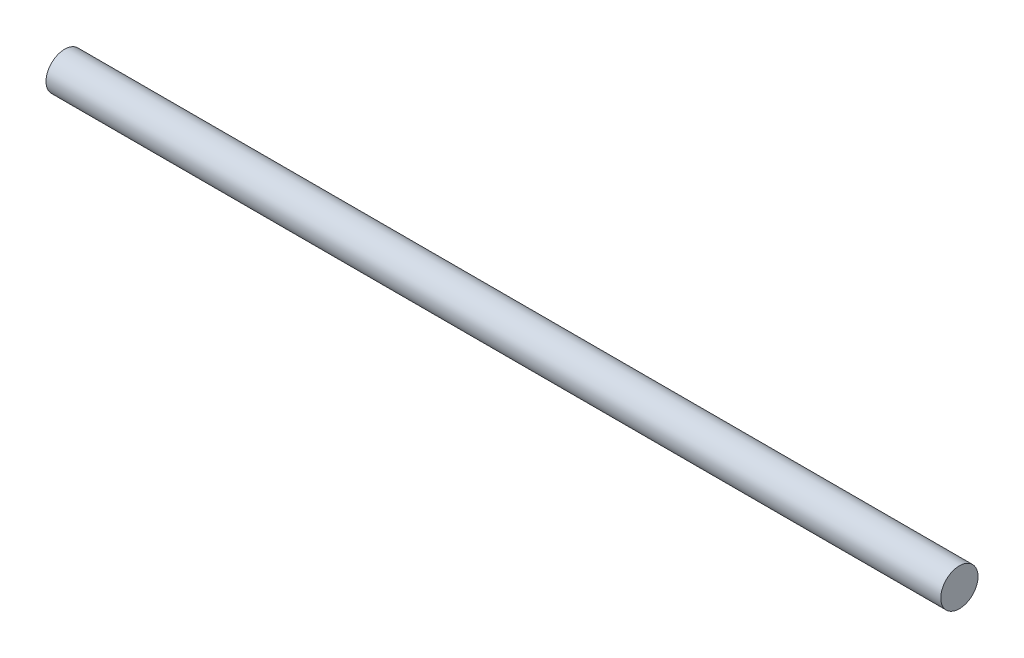
ISO-10303-21;
HEADER;
FILE_DESCRIPTION(('STEP AP214'),'2;1');
FILE_NAME('part.step','',(''),(''),'','','');
FILE_SCHEMA(('AUTOMOTIVE_DESIGN { 1 0 10303 214 1 1 1 1 }'));
ENDSEC;
DATA;
#1=APPLICATION_CONTEXT('core data for automotive mechanical design processes');
#2=APPLICATION_PROTOCOL_DEFINITION('international standard','automotive_design',2000,#1);
#3=PRODUCT_CONTEXT('',#1,'mechanical');
#4=PRODUCT('Part','Part','',(#3));
#5=PRODUCT_RELATED_PRODUCT_CATEGORY('part','',(#4));
#6=PRODUCT_DEFINITION_FORMATION('','',#4);
#7=PRODUCT_DEFINITION_CONTEXT('part definition',#1,'design');
#8=PRODUCT_DEFINITION('design','',#6,#7);
#9=PRODUCT_DEFINITION_SHAPE('','',#8);
#10=(LENGTH_UNIT() NAMED_UNIT(*) SI_UNIT(.MILLI.,.METRE.));
#11=(NAMED_UNIT(*) PLANE_ANGLE_UNIT() SI_UNIT($,.RADIAN.));
#12=(NAMED_UNIT(*) SI_UNIT($,.STERADIAN.) SOLID_ANGLE_UNIT());
#13=UNCERTAINTY_MEASURE_WITH_UNIT(LENGTH_MEASURE(1.E-05),#10,'distance_accuracy_value','');
#14=(GEOMETRIC_REPRESENTATION_CONTEXT(3) GLOBAL_UNCERTAINTY_ASSIGNED_CONTEXT((#13)) GLOBAL_UNIT_ASSIGNED_CONTEXT((#10,
#11,#12)) REPRESENTATION_CONTEXT('',''));
#15=CARTESIAN_POINT('',(0.,0.,0.));
#16=DIRECTION('',(0.,0.,1.));
#17=DIRECTION('',(1.,0.,0.));
#18=AXIS2_PLACEMENT_3D('',#15,#16,#17);
#19=CARTESIAN_POINT('',(152.4,0.,0.));
#20=DIRECTION('',(-1.,0.,0.));
#21=DIRECTION('',(0.,0.,1.));
#22=AXIS2_PLACEMENT_3D('',#19,#20,#21);
#23=CYLINDRICAL_SURFACE('',#22,3.175);
#24=CARTESIAN_POINT('',(152.4,0.,0.));
#25=DIRECTION('',(1.,0.,0.));
#26=DIRECTION('',(0.,0.,-1.));
#27=AXIS2_PLACEMENT_3D('',#24,#25,#26);
#28=CIRCLE('',#27,3.175);
#29=CARTESIAN_POINT('',(152.4,0.,3.175));
#30=VERTEX_POINT('',#29);
#31=EDGE_CURVE('E10',#30,#30,#28,.T.);
#32=CARTESIAN_POINT('',(0.,0.,0.));
#33=DIRECTION('',(1.,0.,0.));
#34=DIRECTION('',(0.,0.,-1.));
#35=AXIS2_PLACEMENT_3D('',#32,#33,#34);
#36=CIRCLE('',#35,3.175);
#37=CARTESIAN_POINT('',(0.,0.,3.175));
#38=VERTEX_POINT('',#37);
#39=EDGE_CURVE('E44',#38,#38,#36,.T.);
#40=CARTESIAN_POINT('',(152.4,0.,3.175));
#41=CARTESIAN_POINT('',(150.8125,0.,3.175));
#42=CARTESIAN_POINT('',(149.225,0.,3.175));
#43=CARTESIAN_POINT('',(146.05,0.,3.175));
#44=CARTESIAN_POINT('',(144.4625,0.,3.175));
#45=CARTESIAN_POINT('',(141.2875,0.,3.175));
#46=CARTESIAN_POINT('',(139.7,0.,3.175));
#47=CARTESIAN_POINT('',(136.525,0.,3.175));
#48=CARTESIAN_POINT('',(134.9375,0.,3.175));
#49=CARTESIAN_POINT('',(131.7625,0.,3.175));
#50=CARTESIAN_POINT('',(130.175,0.,3.175));
#51=CARTESIAN_POINT('',(127.,0.,3.175));
#52=CARTESIAN_POINT('',(125.4125,0.,3.175));
#53=CARTESIAN_POINT('',(122.2375,0.,3.175));
#54=CARTESIAN_POINT('',(120.65,0.,3.175));
#55=CARTESIAN_POINT('',(117.475,0.,3.175));
#56=CARTESIAN_POINT('',(115.8875,0.,3.175));
#57=CARTESIAN_POINT('',(112.7125,0.,3.175));
#58=CARTESIAN_POINT('',(111.125,0.,3.175));
#59=CARTESIAN_POINT('',(107.95,0.,3.175));
#60=CARTESIAN_POINT('',(106.3625,0.,3.175));
#61=CARTESIAN_POINT('',(103.1875,0.,3.175));
#62=CARTESIAN_POINT('',(101.6,0.,3.175));
#63=CARTESIAN_POINT('',(98.425,0.,3.175));
#64=CARTESIAN_POINT('',(96.8375,0.,3.175));
#65=CARTESIAN_POINT('',(93.6625,0.,3.175));
#66=CARTESIAN_POINT('',(92.075,0.,3.175));
#67=CARTESIAN_POINT('',(88.9,0.,3.175));
#68=CARTESIAN_POINT('',(87.3125,0.,3.175));
#69=CARTESIAN_POINT('',(84.1375,0.,3.175));
#70=CARTESIAN_POINT('',(82.55,0.,3.175));
#71=CARTESIAN_POINT('',(79.375,0.,3.175));
#72=CARTESIAN_POINT('',(77.7875,0.,3.175));
#73=CARTESIAN_POINT('',(74.6125,0.,3.175));
#74=CARTESIAN_POINT('',(73.025,0.,3.175));
#75=CARTESIAN_POINT('',(69.85,0.,3.175));
#76=CARTESIAN_POINT('',(68.2625,0.,3.175));
#77=CARTESIAN_POINT('',(65.0875,0.,3.175));
#78=CARTESIAN_POINT('',(63.5,0.,3.175));
#79=CARTESIAN_POINT('',(60.325,0.,3.175));
#80=CARTESIAN_POINT('',(58.7375,0.,3.175));
#81=CARTESIAN_POINT('',(55.5625,0.,3.175));
#82=CARTESIAN_POINT('',(53.975,0.,3.175));
#83=CARTESIAN_POINT('',(50.8,0.,3.175));
#84=CARTESIAN_POINT('',(49.2125,0.,3.175));
#85=CARTESIAN_POINT('',(46.0375,0.,3.175));
#86=CARTESIAN_POINT('',(44.45,0.,3.175));
#87=CARTESIAN_POINT('',(41.275,0.,3.175));
#88=CARTESIAN_POINT('',(39.6875,0.,3.175));
#89=CARTESIAN_POINT('',(36.5125,0.,3.175));
#90=CARTESIAN_POINT('',(34.925,0.,3.175));
#91=CARTESIAN_POINT('',(31.75,0.,3.175));
#92=CARTESIAN_POINT('',(30.1625,0.,3.175));
#93=CARTESIAN_POINT('',(26.9875,0.,3.175));
#94=CARTESIAN_POINT('',(25.4,0.,3.175));
#95=CARTESIAN_POINT('',(22.225,0.,3.175));
#96=CARTESIAN_POINT('',(20.6375,0.,3.175));
#97=CARTESIAN_POINT('',(17.4625,0.,3.175));
#98=CARTESIAN_POINT('',(15.875,0.,3.175));
#99=CARTESIAN_POINT('',(12.7,0.,3.175));
#100=CARTESIAN_POINT('',(11.1125,0.,3.175));
#101=CARTESIAN_POINT('',(7.93750000000001,0.,3.175));
#102=CARTESIAN_POINT('',(6.35,0.,3.175));
#103=CARTESIAN_POINT('',(3.175,0.,3.175));
#104=CARTESIAN_POINT('',(1.5875,0.,3.175));
#105=CARTESIAN_POINT('',(0.,0.,3.175));
#106=B_SPLINE_CURVE_WITH_KNOTS('',3,(#40,#41,#42,#43,#44,#45,#46,#47,#48,#49,#50,#51,#52,#53,
#54,#55,#56,#57,#58,#59,#60,#61,#62,#63,#64,#65,#66,#67,#68,#69,#70,#71,#72,#73,#74,#75,#76,#77,
#78,#79,#80,#81,#82,#83,#84,#85,#86,#87,#88,#89,#90,#91,#92,#93,#94,#95,#96,#97,#98,#99,#100,
#101,#102,#103,#104,#105),.UNSPECIFIED.,.F.,.F.,(4,2,2,2,2,2,2,2,2,2,2,2,2,2,2,2,2,2,2,2,2,2,2,
2,2,2,2,2,2,2,2,2,4),(0.,4.7625,9.52500000000001,14.2875,19.05,23.8125,28.575,33.3375,38.1,
42.8625,47.625,52.3875,57.15,61.9125,66.675,71.4375,76.2,80.9625,85.725,90.4875,95.25,100.0125,
104.775,109.5375,114.3,119.0625,123.825,128.5875,133.35,138.1125,142.875,147.6375,152.4),.UNSPECIFIED.);
#107=EDGE_CURVE('BSEAM41',#30,#38,#106,.T.);
#108=ORIENTED_EDGE('',*,*,#31,.F.);
#109=ORIENTED_EDGE('',*,*,#39,.T.);
#110=ORIENTED_EDGE('',*,*,#107,.T.);
#111=ORIENTED_EDGE('',*,*,#107,.F.);
#112=EDGE_LOOP('',(#108,#110,#109,#111));
#113=FACE_BOUND('',#112,.T.);
#114=ADVANCED_FACE('F41',(#113),#23,.T.);
#115=CARTESIAN_POINT('',(152.4,0.,0.));
#116=DIRECTION('',(1.,0.,0.));
#117=DIRECTION('',(0.,0.,-1.));
#118=AXIS2_PLACEMENT_3D('',#115,#116,#117);
#119=PLANE('',#118);
#120=ORIENTED_EDGE('',*,*,#31,.T.);
#121=EDGE_LOOP('',(#120));
#122=FACE_BOUND('',#121,.T.);
#123=ADVANCED_FACE('F58',(#122),#119,.T.);
#124=CARTESIAN_POINT('',(0.,0.,0.));
#125=DIRECTION('',(1.,0.,0.));
#126=DIRECTION('',(0.,0.,-1.));
#127=AXIS2_PLACEMENT_3D('',#124,#125,#126);
#128=PLANE('',#127);
#129=ORIENTED_EDGE('',*,*,#39,.F.);
#130=EDGE_LOOP('',(#129));
#131=FACE_BOUND('',#130,.T.);
#132=ADVANCED_FACE('F56',(#131),#128,.F.);
#133=CLOSED_SHELL('',(#114,#123,#132));
#134=MANIFOLD_SOLID_BREP('B2',#133);
#135=ADVANCED_BREP_SHAPE_REPRESENTATION('',(#18,#134),#14);
#136=SHAPE_DEFINITION_REPRESENTATION(#9,#135);
ENDSEC;
END-ISO-10303-21;
